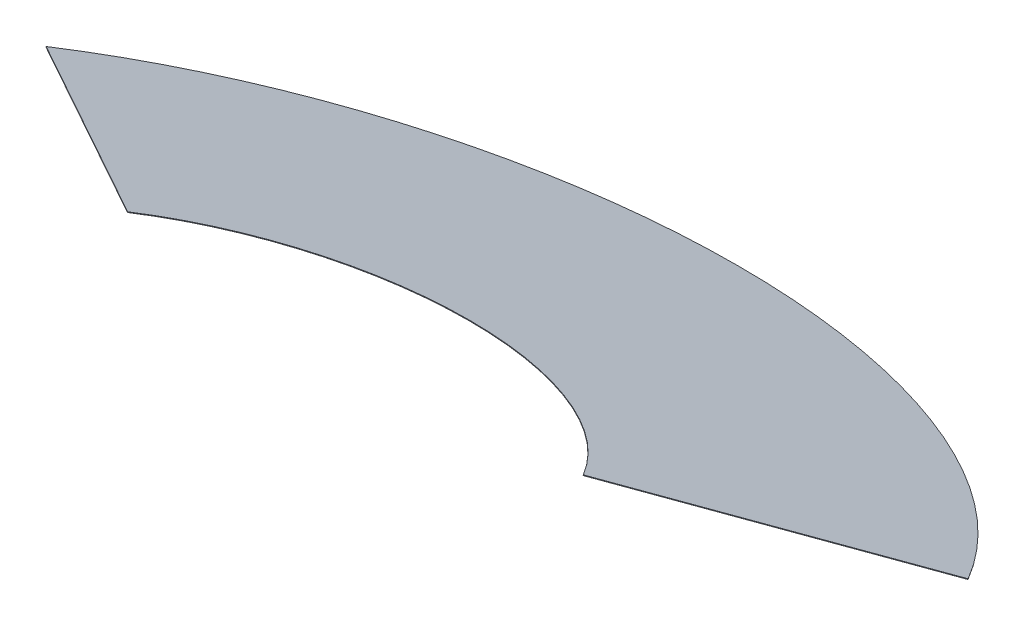
ISO-10303-21;
HEADER;
FILE_DESCRIPTION(('STEP AP214'),'2;1');
FILE_NAME('part.step','',(''),(''),'','','');
FILE_SCHEMA(('AUTOMOTIVE_DESIGN { 1 0 10303 214 1 1 1 1 }'));
ENDSEC;
DATA;
#1=APPLICATION_CONTEXT('core data for automotive mechanical design processes');
#2=APPLICATION_PROTOCOL_DEFINITION('international standard','automotive_design',2000,#1);
#3=PRODUCT_CONTEXT('',#1,'mechanical');
#4=PRODUCT('Part','Part','',(#3));
#5=PRODUCT_RELATED_PRODUCT_CATEGORY('part','',(#4));
#6=PRODUCT_DEFINITION_FORMATION('','',#4);
#7=PRODUCT_DEFINITION_CONTEXT('part definition',#1,'design');
#8=PRODUCT_DEFINITION('design','',#6,#7);
#9=PRODUCT_DEFINITION_SHAPE('','',#8);
#10=(LENGTH_UNIT() NAMED_UNIT(*) SI_UNIT(.MILLI.,.METRE.));
#11=(NAMED_UNIT(*) PLANE_ANGLE_UNIT() SI_UNIT($,.RADIAN.));
#12=(NAMED_UNIT(*) SI_UNIT($,.STERADIAN.) SOLID_ANGLE_UNIT());
#13=UNCERTAINTY_MEASURE_WITH_UNIT(LENGTH_MEASURE(1.E-05),#10,'distance_accuracy_value','');
#14=(GEOMETRIC_REPRESENTATION_CONTEXT(3) GLOBAL_UNCERTAINTY_ASSIGNED_CONTEXT((#13)) GLOBAL_UNIT_ASSIGNED_CONTEXT((#10,
#11,#12)) REPRESENTATION_CONTEXT('',''));
#15=CARTESIAN_POINT('',(0.,0.,0.));
#16=DIRECTION('',(0.,0.,1.));
#17=DIRECTION('',(1.,0.,0.));
#18=AXIS2_PLACEMENT_3D('',#15,#16,#17);
#19=CARTESIAN_POINT('',(0.254,-78.7805622247621,247.764544650586));
#20=DIRECTION('',(0.,0.951056516295156,-0.309016994374941));
#21=DIRECTION('',(0.,0.309016994374941,0.951056516295156));
#22=AXIS2_PLACEMENT_3D('',#19,#20,#21);
#23=PLANE('',#22);
#24=DIRECTION('',(-1.,0.,0.));
#25=VECTOR('',#24,1.);
#26=CARTESIAN_POINT('',(0.254,-78.7805622247621,247.764544650586));
#27=LINE('',#26,#25);
#28=CARTESIAN_POINT('',(0.254,-78.7805622247619,247.764544650586));
#29=VERTEX_POINT('',#28);
#30=CARTESIAN_POINT('',(-0.253999999999986,-78.780562224762,247.764544650586));
#31=VERTEX_POINT('',#30);
#32=EDGE_CURVE('E158',#29,#31,#27,.T.);
#33=ORIENTED_EDGE('',*,*,#32,.T.);
#34=CARTESIAN_POINT('',(-0.254,-0.270556557755611,489.393496595473));
#35=DIRECTION('',(0.,-0.951056516295156,0.309016994374941));
#36=DIRECTION('',(0.,-0.309016994374941,-0.951056516295156));
#37=AXIS2_PLACEMENT_3D('',#34,#35,#36);
#38=CIRCLE('',#37,254.063715252332);
#39=CARTESIAN_POINT('',(-209.943151366491,-44.6000446901876,352.961360758878));
#40=VERTEX_POINT('',#39);
#41=EDGE_CURVE('E61',#40,#31,#38,.T.);
#42=ORIENTED_EDGE('',*,*,#41,.F.);
#43=DIRECTION('',(0.82534080538904,0.174481775519991,0.536999688054995));
#44=VECTOR('',#43,1.);
#45=CARTESIAN_POINT('',(-424.820630049528,-90.0263749468171,213.15349197376));
#46=LINE('',#45,#44);
#47=CARTESIAN_POINT('',(-424.820630049528,-90.0263749468142,213.15349197376));
#48=VERTEX_POINT('',#47);
#49=EDGE_CURVE('E146',#48,#40,#46,.T.);
#50=ORIENTED_EDGE('',*,*,#49,.F.);
#51=CARTESIAN_POINT('',(-0.254,-0.270556557755611,489.393496595473));
#52=DIRECTION('',(0.,0.951056516295156,-0.309016994374941));
#53=DIRECTION('',(0.,0.309016994374941,0.951056516295156));
#54=AXIS2_PLACEMENT_3D('',#51,#52,#53);
#55=CIRCLE('',#54,514.413715252332);
#56=CARTESIAN_POINT('',(-0.254,-159.233136710278,0.156980633142512));
#57=VERTEX_POINT('',#56);
#58=EDGE_CURVE('E113',#57,#48,#55,.T.);
#59=ORIENTED_EDGE('',*,*,#58,.F.);
#60=DIRECTION('',(-1.,0.,0.));
#61=VECTOR('',#60,1.);
#62=CARTESIAN_POINT('',(0.254,-159.233136710278,0.156980633142401));
#63=LINE('',#62,#61);
#64=CARTESIAN_POINT('',(0.253999999999971,-159.233136710278,0.156980633142234));
#65=VERTEX_POINT('',#64);
#66=EDGE_CURVE('E154',#65,#57,#63,.T.);
#67=ORIENTED_EDGE('',*,*,#66,.F.);
#68=CARTESIAN_POINT('',(0.254,-0.270556557755625,489.393496595473));
#69=DIRECTION('',(0.,0.951056516295156,-0.309016994374941));
#70=DIRECTION('',(0.,0.309016994374941,0.951056516295156));
#71=AXIS2_PLACEMENT_3D('',#68,#69,#70);
#72=CIRCLE('',#71,514.413715252332);
#73=CARTESIAN_POINT('',(424.820630049528,-90.0263749468171,213.15349197376));
#74=VERTEX_POINT('',#73);
#75=EDGE_CURVE('E53',#74,#65,#72,.T.);
#76=ORIENTED_EDGE('',*,*,#75,.F.);
#77=DIRECTION('',(0.82534080538904,-0.174481775519991,-0.536999688054996));
#78=VECTOR('',#77,1.);
#79=CARTESIAN_POINT('',(209.943151366491,-44.6000446901874,352.961360758878));
#80=LINE('',#79,#78);
#81=CARTESIAN_POINT('',(209.943151366491,-44.6000446901889,352.961360758879));
#82=VERTEX_POINT('',#81);
#83=EDGE_CURVE('E132',#82,#74,#80,.T.);
#84=ORIENTED_EDGE('',*,*,#83,.F.);
#85=CARTESIAN_POINT('',(0.254,-0.270556557755625,489.393496595473));
#86=DIRECTION('',(0.,-0.951056516295156,0.309016994374941));
#87=DIRECTION('',(0.,-0.309016994374941,-0.951056516295156));
#88=AXIS2_PLACEMENT_3D('',#85,#86,#87);
#89=CIRCLE('',#88,254.063715252331);
#90=EDGE_CURVE('E108',#29,#82,#89,.T.);
#91=ORIENTED_EDGE('',*,*,#90,.F.);
#92=EDGE_LOOP('',(#33,#42,#50,#59,#67,#76,#84,#91));
#93=FACE_BOUND('',#92,.T.);
#94=ADVANCED_FACE('F38',(#93),#23,.F.);
#95=CARTESIAN_POINT('',(0.254,416.918645225282,86.7021087430292));
#96=DIRECTION('',(0.,0.309016994374941,0.951056516295156));
#97=DIRECTION('',(0.,-0.951056516295156,0.309016994374941));
#98=AXIS2_PLACEMENT_3D('',#95,#96,#97);
#99=PLANE('',#98);
#100=ORIENTED_EDGE('',*,*,#32,.F.);
#101=DIRECTION('',(0.,-0.951056516295156,0.309016994374941));
#102=VECTOR('',#101,1.);
#103=CARTESIAN_POINT('',(0.254,416.918645225282,86.7021087430292));
#104=LINE('',#103,#102);
#105=CARTESIAN_POINT('',(0.254,-78.2974255144839,247.607564017444));
#106=VERTEX_POINT('',#105);
#107=EDGE_CURVE('E46',#106,#29,#104,.T.);
#108=ORIENTED_EDGE('',*,*,#107,.F.);
#109=DIRECTION('',(-1.,0.,0.));
#110=VECTOR('',#109,1.);
#111=CARTESIAN_POINT('',(0.254,-78.2974255144841,247.607564017444));
#112=LINE('',#111,#110);
#113=CARTESIAN_POINT('',(-0.254,-78.297425514484,247.607564017444));
#114=VERTEX_POINT('',#113);
#115=EDGE_CURVE('E124',#106,#114,#112,.T.);
#116=ORIENTED_EDGE('',*,*,#115,.T.);
#117=DIRECTION('',(0.,-0.951056516295156,0.309016994374941));
#118=VECTOR('',#117,1.);
#119=CARTESIAN_POINT('',(-0.254,416.918645225282,86.7021087430292));
#120=LINE('',#119,#118);
#121=EDGE_CURVE('E165',#114,#31,#120,.T.);
#122=ORIENTED_EDGE('',*,*,#121,.T.);
#123=EDGE_LOOP('',(#100,#108,#116,#122));
#124=FACE_BOUND('',#123,.T.);
#125=ADVANCED_FACE('F170',(#124),#99,.T.);
#126=CARTESIAN_POINT('',(0.254,336.466070739767,-160.905455274415));
#127=DIRECTION('',(0.,0.309016994374941,0.951056516295156));
#128=DIRECTION('',(0.,-0.951056516295156,0.309016994374941));
#129=AXIS2_PLACEMENT_3D('',#126,#127,#128);
#130=PLANE('',#129);
#131=DIRECTION('',(0.,-0.951056516295156,0.309016994374941));
#132=VECTOR('',#131,1.);
#133=CARTESIAN_POINT('',(0.254,336.466070739767,-160.905455274415));
#134=LINE('',#133,#132);
#135=CARTESIAN_POINT('',(0.254,-158.75,-6.66133814775094E-13));
#136=VERTEX_POINT('',#135);
#137=EDGE_CURVE('E11',#136,#65,#134,.T.);
#138=ORIENTED_EDGE('',*,*,#137,.T.);
#139=ORIENTED_EDGE('',*,*,#66,.T.);
#140=DIRECTION('',(0.,-0.951056516295156,0.309016994374941));
#141=VECTOR('',#140,1.);
#142=CARTESIAN_POINT('',(-0.254,336.466070739767,-160.905455274415));
#143=LINE('',#142,#141);
#144=CARTESIAN_POINT('',(-0.254,-158.75,0.));
#145=VERTEX_POINT('',#144);
#146=EDGE_CURVE('E163',#145,#57,#143,.T.);
#147=ORIENTED_EDGE('',*,*,#146,.F.);
#148=DIRECTION('',(-1.,0.,0.));
#149=VECTOR('',#148,1.);
#150=CARTESIAN_POINT('',(0.254,-158.75,0.));
#151=LINE('',#150,#149);
#152=EDGE_CURVE('E161',#136,#145,#151,.T.);
#153=ORIENTED_EDGE('',*,*,#152,.F.);
#154=EDGE_LOOP('',(#138,#139,#147,#153));
#155=FACE_BOUND('',#154,.T.);
#156=ADVANCED_FACE('F183',(#155),#130,.F.);
#157=CARTESIAN_POINT('',(0.254,-78.2974255144841,247.607564017444));
#158=DIRECTION('',(0.,0.951056516295156,-0.309016994374941));
#159=DIRECTION('',(0.,0.309016994374941,0.951056516295156));
#160=AXIS2_PLACEMENT_3D('',#157,#158,#159);
#161=PLANE('',#160);
#162=ORIENTED_EDGE('',*,*,#152,.T.);
#163=CARTESIAN_POINT('',(-0.254,0.21258015252236,489.236515962331));
#164=DIRECTION('',(0.,0.951056516295156,-0.309016994374941));
#165=DIRECTION('',(0.,0.309016994374941,0.951056516295156));
#166=AXIS2_PLACEMENT_3D('',#163,#164,#165);
#167=CIRCLE('',#166,514.413715252332);
#168=CARTESIAN_POINT('',(-424.820630049528,-89.5432382365363,212.996511340617));
#169=VERTEX_POINT('',#168);
#170=EDGE_CURVE('E141',#145,#169,#167,.T.);
#171=ORIENTED_EDGE('',*,*,#170,.T.);
#172=DIRECTION('',(0.82534080538904,0.174481775519991,0.536999688054995));
#173=VECTOR('',#172,1.);
#174=CARTESIAN_POINT('',(-424.820630049528,-89.5432382365392,212.996511340618));
#175=LINE('',#174,#173);
#176=CARTESIAN_POINT('',(-209.943151366491,-44.1169079799097,352.804380125736));
#177=VERTEX_POINT('',#176);
#178=EDGE_CURVE('E137',#169,#177,#175,.T.);
#179=ORIENTED_EDGE('',*,*,#178,.T.);
#180=CARTESIAN_POINT('',(-0.254,0.21258015252236,489.236515962331));
#181=DIRECTION('',(0.,-0.951056516295156,0.309016994374941));
#182=DIRECTION('',(0.,-0.309016994374941,-0.951056516295156));
#183=AXIS2_PLACEMENT_3D('',#180,#181,#182);
#184=CIRCLE('',#183,254.063715252332);
#185=EDGE_CURVE('E140',#177,#114,#184,.T.);
#186=ORIENTED_EDGE('',*,*,#185,.T.);
#187=ORIENTED_EDGE('',*,*,#115,.F.);
#188=CARTESIAN_POINT('',(0.254,0.212580152522346,489.236515962331));
#189=DIRECTION('',(0.,-0.951056516295156,0.309016994374941));
#190=DIRECTION('',(0.,-0.309016994374941,-0.951056516295156));
#191=AXIS2_PLACEMENT_3D('',#188,#189,#190);
#192=CIRCLE('',#191,254.063715252331);
#193=CARTESIAN_POINT('',(209.943151366491,-44.1169079799109,352.804380125736));
#194=VERTEX_POINT('',#193);
#195=EDGE_CURVE('E105',#106,#194,#192,.T.);
#196=ORIENTED_EDGE('',*,*,#195,.T.);
#197=DIRECTION('',(0.82534080538904,-0.174481775519991,-0.536999688054996));
#198=VECTOR('',#197,1.);
#199=CARTESIAN_POINT('',(209.943151366491,-44.1169079799095,352.804380125736));
#200=LINE('',#199,#198);
#201=CARTESIAN_POINT('',(424.820630049528,-89.5432382365392,212.996511340618));
#202=VERTEX_POINT('',#201);
#203=EDGE_CURVE('E120',#194,#202,#200,.T.);
#204=ORIENTED_EDGE('',*,*,#203,.T.);
#205=CARTESIAN_POINT('',(0.254,0.212580152522346,489.236515962331));
#206=DIRECTION('',(0.,0.951056516295156,-0.309016994374941));
#207=DIRECTION('',(0.,0.309016994374941,0.951056516295156));
#208=AXIS2_PLACEMENT_3D('',#205,#206,#207);
#209=CIRCLE('',#208,514.413715252332);
#210=EDGE_CURVE('E128',#202,#136,#209,.T.);
#211=ORIENTED_EDGE('',*,*,#210,.T.);
#212=EDGE_LOOP('',(#162,#171,#179,#186,#187,#196,#204,#211));
#213=FACE_BOUND('',#212,.T.);
#214=ADVANCED_FACE('F40',(#213),#161,.T.);
#215=CARTESIAN_POINT('',(-0.254,0.,489.305587440914));
#216=DIRECTION('',(0.,0.951056516295156,-0.309016994374941));
#217=DIRECTION('',(0.,0.309016994374941,0.951056516295156));
#218=AXIS2_PLACEMENT_3D('',#215,#216,#217);
#219=CYLINDRICAL_SURFACE('',#218,514.413715252332);
#220=ORIENTED_EDGE('',*,*,#146,.T.);
#221=ORIENTED_EDGE('',*,*,#58,.T.);
#222=DIRECTION('',(0.,0.951056516295156,-0.309016994374941));
#223=VECTOR('',#222,1.);
#224=CARTESIAN_POINT('',(-424.820630049528,-89.7558183890557,213.065582819199));
#225=LINE('',#224,#223);
#226=EDGE_CURVE('E152',#48,#169,#225,.T.);
#227=ORIENTED_EDGE('',*,*,#226,.T.);
#228=ORIENTED_EDGE('',*,*,#170,.F.);
#229=EDGE_LOOP('',(#220,#221,#227,#228));
#230=FACE_BOUND('',#229,.T.);
#231=ADVANCED_FACE('F179',(#230),#219,.T.);
#232=CARTESIAN_POINT('',(-424.820630049528,-89.7558183890615,213.0655828192));
#233=DIRECTION('',(-0.56463488641756,0.255044335016314,0.784945751129539));
#234=DIRECTION('',(0.82534080538904,0.174481775519991,0.536999688054995));
#235=AXIS2_PLACEMENT_3D('',#232,#233,#234);
#236=PLANE('',#235);
#237=ORIENTED_EDGE('',*,*,#226,.F.);
#238=ORIENTED_EDGE('',*,*,#49,.T.);
#239=DIRECTION('',(0.,0.951056516295156,-0.309016994374941));
#240=VECTOR('',#239,1.);
#241=CARTESIAN_POINT('',(-209.943151366491,-44.329488132432,352.873451604319));
#242=LINE('',#241,#240);
#243=EDGE_CURVE('E145',#40,#177,#242,.T.);
#244=ORIENTED_EDGE('',*,*,#243,.T.);
#245=ORIENTED_EDGE('',*,*,#178,.F.);
#246=EDGE_LOOP('',(#237,#238,#244,#245));
#247=FACE_BOUND('',#246,.T.);
#248=ADVANCED_FACE('F175',(#247),#236,.T.);
#249=CARTESIAN_POINT('',(-0.254,0.,489.305587440914));
#250=DIRECTION('',(0.,-0.951056516295156,0.309016994374941));
#251=DIRECTION('',(0.,-0.309016994374941,-0.951056516295156));
#252=AXIS2_PLACEMENT_3D('',#249,#250,#251);
#253=CYLINDRICAL_SURFACE('',#252,254.063715252332);
#254=ORIENTED_EDGE('',*,*,#41,.T.);
#255=ORIENTED_EDGE('',*,*,#121,.F.);
#256=ORIENTED_EDGE('',*,*,#185,.F.);
#257=ORIENTED_EDGE('',*,*,#243,.F.);
#258=EDGE_LOOP('',(#254,#255,#256,#257));
#259=FACE_BOUND('',#258,.T.);
#260=ADVANCED_FACE('F172',(#259),#253,.F.);
#261=CARTESIAN_POINT('',(0.254,0.,489.305587440913));
#262=DIRECTION('',(0.,-0.951056516295156,0.309016994374941));
#263=DIRECTION('',(0.,-0.309016994374941,-0.951056516295156));
#264=AXIS2_PLACEMENT_3D('',#261,#262,#263);
#265=CYLINDRICAL_SURFACE('',#264,254.063715252331);
#266=ORIENTED_EDGE('',*,*,#107,.T.);
#267=ORIENTED_EDGE('',*,*,#90,.T.);
#268=DIRECTION('',(0.,0.951056516295156,-0.309016994374941));
#269=VECTOR('',#268,1.);
#270=CARTESIAN_POINT('',(209.943151366491,-44.3294881324347,352.87345160432));
#271=LINE('',#270,#269);
#272=EDGE_CURVE('E102',#82,#194,#271,.T.);
#273=ORIENTED_EDGE('',*,*,#272,.T.);
#274=ORIENTED_EDGE('',*,*,#195,.F.);
#275=EDGE_LOOP('',(#266,#267,#273,#274));
#276=FACE_BOUND('',#275,.T.);
#277=ADVANCED_FACE('F104',(#276),#265,.F.);
#278=CARTESIAN_POINT('',(209.943151366491,-44.3294881324318,352.873451604319));
#279=DIRECTION('',(0.56463488641756,0.255044335016314,0.784945751129538));
#280=DIRECTION('',(0.82534080538904,-0.174481775519991,-0.536999688054996));
#281=AXIS2_PLACEMENT_3D('',#278,#279,#280);
#282=PLANE('',#281);
#283=ORIENTED_EDGE('',*,*,#272,.F.);
#284=ORIENTED_EDGE('',*,*,#83,.T.);
#285=DIRECTION('',(0.,0.951056516295156,-0.309016994374941));
#286=VECTOR('',#285,1.);
#287=CARTESIAN_POINT('',(424.820630049528,-89.7558183890614,213.0655828192));
#288=LINE('',#287,#286);
#289=EDGE_CURVE('E114',#74,#202,#288,.T.);
#290=ORIENTED_EDGE('',*,*,#289,.T.);
#291=ORIENTED_EDGE('',*,*,#203,.F.);
#292=EDGE_LOOP('',(#283,#284,#290,#291));
#293=FACE_BOUND('',#292,.T.);
#294=ADVANCED_FACE('F127',(#293),#282,.T.);
#295=CARTESIAN_POINT('',(0.254,0.,489.305587440913));
#296=DIRECTION('',(0.,0.951056516295156,-0.309016994374941));
#297=DIRECTION('',(0.,0.309016994374941,0.951056516295156));
#298=AXIS2_PLACEMENT_3D('',#295,#296,#297);
#299=CYLINDRICAL_SURFACE('',#298,514.413715252332);
#300=ORIENTED_EDGE('',*,*,#75,.T.);
#301=ORIENTED_EDGE('',*,*,#137,.F.);
#302=ORIENTED_EDGE('',*,*,#210,.F.);
#303=ORIENTED_EDGE('',*,*,#289,.F.);
#304=EDGE_LOOP('',(#300,#301,#302,#303));
#305=FACE_BOUND('',#304,.T.);
#306=ADVANCED_FACE('F184',(#305),#299,.T.);
#307=CLOSED_SHELL('',(#94,#125,#156,#214,#231,#248,#260,#277,#294,#306));
#308=MANIFOLD_SOLID_BREP('B2',#307);
#309=ADVANCED_BREP_SHAPE_REPRESENTATION('',(#18,#308),#14);
#310=SHAPE_DEFINITION_REPRESENTATION(#9,#309);
ENDSEC;
END-ISO-10303-21;
